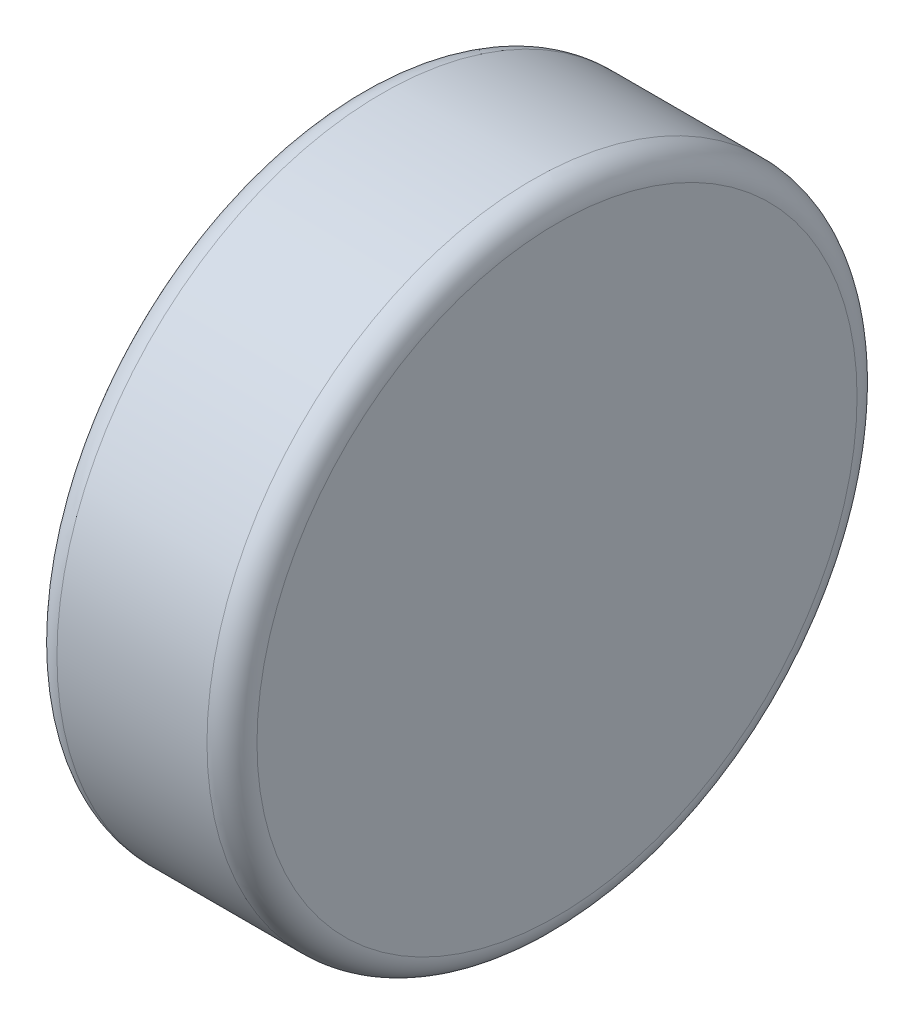
ISO-10303-21;
HEADER;
FILE_DESCRIPTION(('STEP AP214'),'2;1');
FILE_NAME('part.step','',(''),(''),'','','');
FILE_SCHEMA(('AUTOMOTIVE_DESIGN { 1 0 10303 214 1 1 1 1 }'));
ENDSEC;
DATA;
#1=APPLICATION_CONTEXT('core data for automotive mechanical design processes');
#2=APPLICATION_PROTOCOL_DEFINITION('international standard','automotive_design',2000,#1);
#3=PRODUCT_CONTEXT('',#1,'mechanical');
#4=PRODUCT('Part','Part','',(#3));
#5=PRODUCT_RELATED_PRODUCT_CATEGORY('part','',(#4));
#6=PRODUCT_DEFINITION_FORMATION('','',#4);
#7=PRODUCT_DEFINITION_CONTEXT('part definition',#1,'design');
#8=PRODUCT_DEFINITION('design','',#6,#7);
#9=PRODUCT_DEFINITION_SHAPE('','',#8);
#10=(LENGTH_UNIT() NAMED_UNIT(*) SI_UNIT(.MILLI.,.METRE.));
#11=(NAMED_UNIT(*) PLANE_ANGLE_UNIT() SI_UNIT($,.RADIAN.));
#12=(NAMED_UNIT(*) SI_UNIT($,.STERADIAN.) SOLID_ANGLE_UNIT());
#13=UNCERTAINTY_MEASURE_WITH_UNIT(LENGTH_MEASURE(1.E-05),#10,'distance_accuracy_value','');
#14=(GEOMETRIC_REPRESENTATION_CONTEXT(3) GLOBAL_UNCERTAINTY_ASSIGNED_CONTEXT((#13)) GLOBAL_UNIT_ASSIGNED_CONTEXT((#10,
#11,#12)) REPRESENTATION_CONTEXT('',''));
#15=CARTESIAN_POINT('',(0.,0.,0.));
#16=DIRECTION('',(0.,0.,1.));
#17=DIRECTION('',(1.,0.,0.));
#18=AXIS2_PLACEMENT_3D('',#15,#16,#17);
#19=CARTESIAN_POINT('',(0.,0.,0.));
#20=DIRECTION('',(1.,0.,0.));
#21=DIRECTION('',(0.,0.,-1.));
#22=AXIS2_PLACEMENT_3D('',#19,#20,#21);
#23=PLANE('',#22);
#24=CARTESIAN_POINT('',(0.,0.,0.));
#25=DIRECTION('',(1.,0.,0.));
#26=DIRECTION('',(0.,0.,-1.));
#27=AXIS2_PLACEMENT_3D('',#24,#25,#26);
#28=CIRCLE('',#27,152.4);
#29=CARTESIAN_POINT('',(0.,0.,-152.4));
#30=VERTEX_POINT('',#29);
#31=EDGE_CURVE('E10',#30,#30,#28,.F.);
#32=ORIENTED_EDGE('',*,*,#31,.T.);
#33=EDGE_LOOP('',(#32));
#34=FACE_BOUND('',#33,.T.);
#35=ADVANCED_FACE('F32',(#34),#23,.F.);
#36=CARTESIAN_POINT('',(0.,0.,0.));
#37=DIRECTION('',(-1.,0.,0.));
#38=DIRECTION('',(0.,0.,1.));
#39=AXIS2_PLACEMENT_3D('',#36,#37,#38);
#40=CYLINDRICAL_SURFACE('',#39,165.1);
#41=CARTESIAN_POINT('',(88.9,0.,0.));
#42=DIRECTION('',(-1.,0.,0.));
#43=DIRECTION('',(0.,0.,1.));
#44=AXIS2_PLACEMENT_3D('',#41,#42,#43);
#45=CIRCLE('',#44,165.1);
#46=CARTESIAN_POINT('',(88.9,0.,165.1));
#47=VERTEX_POINT('',#46);
#48=EDGE_CURVE('E43',#47,#47,#45,.T.);
#49=ORIENTED_EDGE('',*,*,#48,.T.);
#50=EDGE_LOOP('',(#49));
#51=FACE_BOUND('',#50,.T.);
#52=CARTESIAN_POINT('',(12.7,0.,0.));
#53=DIRECTION('',(1.,0.,0.));
#54=DIRECTION('',(0.,0.,-1.));
#55=AXIS2_PLACEMENT_3D('',#52,#53,#54);
#56=CIRCLE('',#55,165.1);
#57=CARTESIAN_POINT('',(12.7,0.,-165.1));
#58=VERTEX_POINT('',#57);
#59=EDGE_CURVE('E47',#58,#58,#56,.T.);
#60=ORIENTED_EDGE('',*,*,#59,.T.);
#61=EDGE_LOOP('',(#60));
#62=FACE_BOUND('',#61,.T.);
#63=ADVANCED_FACE('F53',(#51,#62),#40,.T.);
#64=CARTESIAN_POINT('',(101.6,0.,0.));
#65=DIRECTION('',(-1.,0.,0.));
#66=DIRECTION('',(0.,0.,1.));
#67=AXIS2_PLACEMENT_3D('',#64,#65,#66);
#68=PLANE('',#67);
#69=CARTESIAN_POINT('',(101.6,0.,0.));
#70=DIRECTION('',(-1.,0.,0.));
#71=DIRECTION('',(0.,0.,1.));
#72=AXIS2_PLACEMENT_3D('',#69,#70,#71);
#73=CIRCLE('',#72,152.4);
#74=CARTESIAN_POINT('',(101.6,0.,152.4));
#75=VERTEX_POINT('',#74);
#76=EDGE_CURVE('E39',#75,#75,#73,.F.);
#77=ORIENTED_EDGE('',*,*,#76,.T.);
#78=EDGE_LOOP('',(#77));
#79=FACE_BOUND('',#78,.T.);
#80=ADVANCED_FACE('F61',(#79),#68,.F.);
#81=CARTESIAN_POINT('',(88.9,0.,0.));
#82=DIRECTION('',(-1.,0.,0.));
#83=DIRECTION('',(0.,0.,1.));
#84=AXIS2_PLACEMENT_3D('',#81,#82,#83);
#85=TOROIDAL_SURFACE('',#84,152.4,12.7);
#86=ORIENTED_EDGE('',*,*,#76,.F.);
#87=EDGE_LOOP('',(#86));
#88=FACE_BOUND('',#87,.T.);
#89=ORIENTED_EDGE('',*,*,#48,.F.);
#90=EDGE_LOOP('',(#89));
#91=FACE_BOUND('',#90,.T.);
#92=ADVANCED_FACE('F57',(#88,#91),#85,.T.);
#93=CARTESIAN_POINT('',(12.7,0.,0.));
#94=DIRECTION('',(1.,0.,0.));
#95=DIRECTION('',(0.,0.,-1.));
#96=AXIS2_PLACEMENT_3D('',#93,#94,#95);
#97=TOROIDAL_SURFACE('',#96,152.4,12.7);
#98=ORIENTED_EDGE('',*,*,#59,.F.);
#99=EDGE_LOOP('',(#98));
#100=FACE_BOUND('',#99,.T.);
#101=ORIENTED_EDGE('',*,*,#31,.F.);
#102=EDGE_LOOP('',(#101));
#103=FACE_BOUND('',#102,.T.);
#104=ADVANCED_FACE('F34',(#100,#103),#97,.T.);
#105=CLOSED_SHELL('',(#35,#63,#80,#92,#104));
#106=MANIFOLD_SOLID_BREP('B2',#105);
#107=ADVANCED_BREP_SHAPE_REPRESENTATION('',(#18,#106),#14);
#108=SHAPE_DEFINITION_REPRESENTATION(#9,#107);
ENDSEC;
END-ISO-10303-21;
